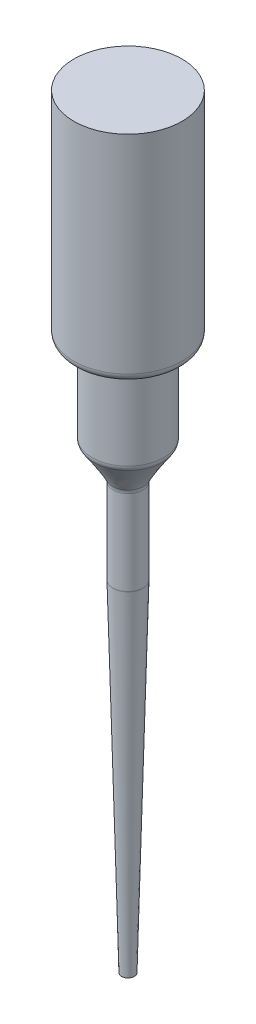
ISO-10303-21;
HEADER;
FILE_DESCRIPTION(('STEP AP214'),'2;1');
FILE_NAME('part.step','',(''),(''),'','','');
FILE_SCHEMA(('AUTOMOTIVE_DESIGN { 1 0 10303 214 1 1 1 1 }'));
ENDSEC;
DATA;
#1=APPLICATION_CONTEXT('core data for automotive mechanical design processes');
#2=APPLICATION_PROTOCOL_DEFINITION('international standard','automotive_design',2000,#1);
#3=PRODUCT_CONTEXT('',#1,'mechanical');
#4=PRODUCT('Part','Part','',(#3));
#5=PRODUCT_RELATED_PRODUCT_CATEGORY('part','',(#4));
#6=PRODUCT_DEFINITION_FORMATION('','',#4);
#7=PRODUCT_DEFINITION_CONTEXT('part definition',#1,'design');
#8=PRODUCT_DEFINITION('design','',#6,#7);
#9=PRODUCT_DEFINITION_SHAPE('','',#8);
#10=(LENGTH_UNIT() NAMED_UNIT(*) SI_UNIT(.MILLI.,.METRE.));
#11=(NAMED_UNIT(*) PLANE_ANGLE_UNIT() SI_UNIT($,.RADIAN.));
#12=(NAMED_UNIT(*) SI_UNIT($,.STERADIAN.) SOLID_ANGLE_UNIT());
#13=UNCERTAINTY_MEASURE_WITH_UNIT(LENGTH_MEASURE(1.E-05),#10,'distance_accuracy_value','');
#14=(GEOMETRIC_REPRESENTATION_CONTEXT(3) GLOBAL_UNCERTAINTY_ASSIGNED_CONTEXT((#13)) GLOBAL_UNIT_ASSIGNED_CONTEXT((#10,
#11,#12)) REPRESENTATION_CONTEXT('',''));
#15=CARTESIAN_POINT('',(0.,0.,0.));
#16=DIRECTION('',(0.,0.,1.));
#17=DIRECTION('',(1.,0.,0.));
#18=AXIS2_PLACEMENT_3D('',#15,#16,#17);
#19=CARTESIAN_POINT('',(0.,127.,0.));
#20=DIRECTION('',(0.,-1.,0.));
#21=DIRECTION('',(0.,0.,-1.));
#22=AXIS2_PLACEMENT_3D('',#19,#20,#21);
#23=CYLINDRICAL_SURFACE('',#22,31.75);
#24=CARTESIAN_POINT('',(0.,5.,0.));
#25=DIRECTION('',(0.,1.,0.));
#26=DIRECTION('',(0.,0.,1.));
#27=AXIS2_PLACEMENT_3D('',#24,#25,#26);
#28=CIRCLE('',#27,31.75);
#29=CARTESIAN_POINT('',(0.,5.,31.75));
#30=VERTEX_POINT('',#29);
#31=EDGE_CURVE('E53',#30,#30,#28,.T.);
#32=ORIENTED_EDGE('',*,*,#31,.T.);
#33=EDGE_LOOP('',(#32));
#34=FACE_BOUND('',#33,.T.);
#35=CARTESIAN_POINT('',(0.,127.,0.));
#36=DIRECTION('',(0.,1.,0.));
#37=DIRECTION('',(0.,0.,1.));
#38=AXIS2_PLACEMENT_3D('',#35,#36,#37);
#39=CIRCLE('',#38,31.75);
#40=CARTESIAN_POINT('',(0.,127.,31.75));
#41=VERTEX_POINT('',#40);
#42=EDGE_CURVE('E86',#41,#41,#39,.T.);
#43=ORIENTED_EDGE('',*,*,#42,.F.);
#44=EDGE_LOOP('',(#43));
#45=FACE_BOUND('',#44,.T.);
#46=ADVANCED_FACE('F45',(#34,#45),#23,.T.);
#47=CARTESIAN_POINT('',(0.,127.,0.));
#48=DIRECTION('',(0.,1.,0.));
#49=DIRECTION('',(0.,0.,1.));
#50=AXIS2_PLACEMENT_3D('',#47,#48,#49);
#51=PLANE('',#50);
#52=ORIENTED_EDGE('',*,*,#42,.T.);
#53=EDGE_LOOP('',(#52));
#54=FACE_BOUND('',#53,.T.);
#55=ADVANCED_FACE('F139',(#54),#51,.T.);
#56=CARTESIAN_POINT('',(0.,0.,0.));
#57=DIRECTION('',(0.,1.,0.));
#58=DIRECTION('',(0.,0.,1.));
#59=AXIS2_PLACEMENT_3D('',#56,#57,#58);
#60=PLANE('',#59);
#61=CARTESIAN_POINT('',(0.,0.,0.));
#62=DIRECTION('',(0.,1.,0.));
#63=DIRECTION('',(0.,0.,1.));
#64=AXIS2_PLACEMENT_3D('',#61,#62,#63);
#65=CIRCLE('',#64,26.75);
#66=CARTESIAN_POINT('',(0.,0.,26.75));
#67=VERTEX_POINT('',#66);
#68=EDGE_CURVE('E11',#67,#67,#65,.F.);
#69=ORIENTED_EDGE('',*,*,#68,.T.);
#70=EDGE_LOOP('',(#69));
#71=FACE_BOUND('',#70,.T.);
#72=CARTESIAN_POINT('',(0.,0.,0.));
#73=DIRECTION('',(0.,-1.,0.));
#74=DIRECTION('',(0.,0.,-1.));
#75=AXIS2_PLACEMENT_3D('',#72,#73,#74);
#76=CIRCLE('',#75,21.0178498664078);
#77=CARTESIAN_POINT('',(0.,0.,21.0178498664078));
#78=VERTEX_POINT('',#77);
#79=EDGE_CURVE('E85',#78,#78,#76,.T.);
#80=ORIENTED_EDGE('',*,*,#79,.F.);
#81=EDGE_LOOP('',(#80));
#82=FACE_BOUND('',#81,.T.);
#83=ADVANCED_FACE('F137',(#71,#82),#60,.F.);
#84=CARTESIAN_POINT('',(0.,-51.,0.));
#85=DIRECTION('',(0.,1.,0.));
#86=DIRECTION('',(0.,0.,1.));
#87=AXIS2_PLACEMENT_3D('',#84,#85,#86);
#88=CYLINDRICAL_SURFACE('',#87,21.0178498664078);
#89=CARTESIAN_POINT('',(0.,-49.4517571965937,0.));
#90=DIRECTION('',(0.,1.,0.));
#91=DIRECTION('',(0.,0.,1.));
#92=AXIS2_PLACEMENT_3D('',#89,#90,#91);
#93=CIRCLE('',#92,21.0178498664078);
#94=CARTESIAN_POINT('',(0.,-49.4517571965937,21.0178498664078));
#95=VERTEX_POINT('',#94);
#96=EDGE_CURVE('E58',#95,#95,#93,.T.);
#97=CARTESIAN_POINT('',(0.,-49.4517571965937,21.0178498664078));
#98=CARTESIAN_POINT('',(0.,-48.9366347257958,21.0178498664078));
#99=CARTESIAN_POINT('',(0.,-48.421512254998,21.0178498664078));
#100=CARTESIAN_POINT('',(0.,-47.3912673134023,21.0178498664078));
#101=CARTESIAN_POINT('',(0.,-46.8761448426044,21.0178498664078));
#102=CARTESIAN_POINT('',(0.,-45.8458999010087,21.0178498664078));
#103=CARTESIAN_POINT('',(0.,-45.3307774302109,21.0178498664078));
#104=CARTESIAN_POINT('',(0.,-44.3005324886152,21.0178498664078));
#105=CARTESIAN_POINT('',(0.,-43.7854100178173,21.0178498664078));
#106=CARTESIAN_POINT('',(0.,-42.7551650762216,21.0178498664078));
#107=CARTESIAN_POINT('',(0.,-42.2400426054238,21.0178498664078));
#108=CARTESIAN_POINT('',(0.,-41.2097976638281,21.0178498664078));
#109=CARTESIAN_POINT('',(0.,-40.6946751930302,21.0178498664078));
#110=CARTESIAN_POINT('',(0.,-39.6644302514345,21.0178498664078));
#111=CARTESIAN_POINT('',(0.,-39.1493077806367,21.0178498664078));
#112=CARTESIAN_POINT('',(0.,-38.119062839041,21.0178498664078));
#113=CARTESIAN_POINT('',(0.,-37.6039403682431,21.0178498664078));
#114=CARTESIAN_POINT('',(0.,-36.5736954266474,21.0178498664078));
#115=CARTESIAN_POINT('',(0.,-36.0585729558496,21.0178498664078));
#116=CARTESIAN_POINT('',(0.,-35.0283280142539,21.0178498664078));
#117=CARTESIAN_POINT('',(0.,-34.513205543456,21.0178498664078));
#118=CARTESIAN_POINT('',(0.,-33.4829606018603,21.0178498664078));
#119=CARTESIAN_POINT('',(0.,-32.9678381310625,21.0178498664078));
#120=CARTESIAN_POINT('',(0.,-31.9375931894667,21.0178498664078));
#121=CARTESIAN_POINT('',(0.,-31.4224707186689,21.0178498664078));
#122=CARTESIAN_POINT('',(0.,-30.3922257770732,21.0178498664078));
#123=CARTESIAN_POINT('',(0.,-29.8771033062753,21.0178498664078));
#124=CARTESIAN_POINT('',(0.,-28.8468583646796,21.0178498664078));
#125=CARTESIAN_POINT('',(0.,-28.3317358938818,21.0178498664078));
#126=CARTESIAN_POINT('',(0.,-27.3014909522861,21.0178498664078));
#127=CARTESIAN_POINT('',(0.,-26.7863684814882,21.0178498664078));
#128=CARTESIAN_POINT('',(0.,-25.7561235398925,21.0178498664078));
#129=CARTESIAN_POINT('',(0.,-25.2410010690947,21.0178498664078));
#130=CARTESIAN_POINT('',(0.,-24.210756127499,21.0178498664078));
#131=CARTESIAN_POINT('',(0.,-23.6956336567011,21.0178498664078));
#132=CARTESIAN_POINT('',(0.,-22.6653887151054,21.0178498664078));
#133=CARTESIAN_POINT('',(0.,-22.1502662443076,21.0178498664078));
#134=CARTESIAN_POINT('',(0.,-21.1200213027119,21.0178498664078));
#135=CARTESIAN_POINT('',(0.,-20.604898831914,21.0178498664078));
#136=CARTESIAN_POINT('',(0.,-19.5746538903183,21.0178498664078));
#137=CARTESIAN_POINT('',(0.,-19.0595314195205,21.0178498664078));
#138=CARTESIAN_POINT('',(0.,-18.0292864779248,21.0178498664078));
#139=CARTESIAN_POINT('',(0.,-17.5141640071269,21.0178498664078));
#140=CARTESIAN_POINT('',(0.,-16.4839190655312,21.0178498664078));
#141=CARTESIAN_POINT('',(0.,-15.9687965947334,21.0178498664078));
#142=CARTESIAN_POINT('',(0.,-14.9385516531377,21.0178498664078));
#143=CARTESIAN_POINT('',(0.,-14.4234291823398,21.0178498664078));
#144=CARTESIAN_POINT('',(0.,-13.3931842407441,21.0178498664078));
#145=CARTESIAN_POINT('',(0.,-12.8780617699463,21.0178498664078));
#146=CARTESIAN_POINT('',(0.,-11.8478168283506,21.0178498664078));
#147=CARTESIAN_POINT('',(0.,-11.3326943575527,21.0178498664078));
#148=CARTESIAN_POINT('',(0.,-10.302449415957,21.0178498664078));
#149=CARTESIAN_POINT('',(0.,-9.78732694515916,21.0178498664078));
#150=CARTESIAN_POINT('',(0.,-8.75708200356346,21.0178498664078));
#151=CARTESIAN_POINT('',(0.,-8.24195953276561,21.0178498664078));
#152=CARTESIAN_POINT('',(0.,-7.21171459116991,21.0178498664078));
#153=CARTESIAN_POINT('',(0.,-6.69659212037206,21.0178498664078));
#154=CARTESIAN_POINT('',(0.,-5.66634717877636,21.0178498664078));
#155=CARTESIAN_POINT('',(0.,-5.15122470797851,21.0178498664078));
#156=CARTESIAN_POINT('',(0.,-4.1209797663828,21.0178498664078));
#157=CARTESIAN_POINT('',(0.,-3.60585729558495,21.0178498664078));
#158=CARTESIAN_POINT('',(0.,-2.57561235398925,21.0178498664078));
#159=CARTESIAN_POINT('',(0.,-2.0604898831914,21.0178498664078));
#160=CARTESIAN_POINT('',(0.,-1.0302449415957,21.0178498664078));
#161=CARTESIAN_POINT('',(0.,-0.515122470797852,21.0178498664078));
#162=CARTESIAN_POINT('',(0.,0.,21.0178498664078));
#163=B_SPLINE_CURVE_WITH_KNOTS('',3,(#97,#98,#99,#100,#101,#102,#103,#104,#105,#106,#107,#108,
#109,#110,#111,#112,#113,#114,#115,#116,#117,#118,#119,#120,#121,#122,#123,#124,#125,#126,#127,
#128,#129,#130,#131,#132,#133,#134,#135,#136,#137,#138,#139,#140,#141,#142,#143,#144,#145,#146,
#147,#148,#149,#150,#151,#152,#153,#154,#155,#156,#157,#158,#159,#160,#161,#162),.UNSPECIFIED.,
.F.,.F.,(4,2,2,2,2,2,2,2,2,2,2,2,2,2,2,2,2,2,2,2,2,2,2,2,2,2,2,2,2,2,2,2,4),(0.,
1.54536741239356,3.0907348247871,4.63610223718066,6.18146964957422,7.72683706196776,
9.27220447436132,10.8175718867549,12.3629392991484,13.908306711542,15.4536741239355,
16.9990415363291,18.5444089487226,20.0897763611162,21.6351437735097,23.1805111859033,
24.7258785982968,26.2712460106904,27.8166134230839,29.3619808354775,30.9073482478711,
32.4527156602646,33.9980830726581,35.5434504850517,37.0888178974453,38.6341853098388,
40.1795527222324,41.7249201346259,43.2702875470195,44.815654959413,46.3610223718066,
47.9063897842001,49.4517571965937),.UNSPECIFIED.);
#164=EDGE_CURVE('BSEAM128',#95,#78,#163,.T.);
#165=ORIENTED_EDGE('',*,*,#96,.T.);
#166=ORIENTED_EDGE('',*,*,#79,.T.);
#167=ORIENTED_EDGE('',*,*,#164,.T.);
#168=ORIENTED_EDGE('',*,*,#164,.F.);
#169=EDGE_LOOP('',(#165,#167,#166,#168));
#170=FACE_BOUND('',#169,.T.);
#171=ADVANCED_FACE('F128',(#170),#88,.T.);
#172=CARTESIAN_POINT('',(-20.3443344832862,-51.,5.27807421689297));
#173=CARTESIAN_POINT('',(-8.25953812337909,-71.,-2.84042604778188));
#174=CARTESIAN_POINT('',(-30.9004829170722,-51.,-35.4105947496795));
#175=CARTESIAN_POINT('',(-2.57868602781534,-71.,-19.3595022945401));
#176=CARTESIAN_POINT('',(9.78818604950028,-51.,-45.9667431834654));
#177=CARTESIAN_POINT('',(13.9403902189428,-71.,-13.6786501989763));
#178=CARTESIAN_POINT('',(20.3443344832862,-51.,-5.27807421689298));
#179=CARTESIAN_POINT('',(8.25953812337909,-71.,2.84042604778187));
#180=CARTESIAN_POINT('',(30.9004829170722,-51.,35.4105947496795));
#181=CARTESIAN_POINT('',(2.57868602781535,-70.9999999999999,19.3595022945401));
#182=CARTESIAN_POINT('',(-9.78818604950027,-51.,45.9667431834654));
#183=CARTESIAN_POINT('',(-13.9403902189428,-70.9999999999999,13.6786501989763));
#184=CARTESIAN_POINT('',(-20.3443344832862,-51.,5.27807421689297));
#185=CARTESIAN_POINT('',(-8.25953812337909,-71.,-2.84042604778188));
#186=(BOUNDED_SURFACE() B_SPLINE_SURFACE(3,1,((#172,#173),(#174,#175),(#176,#177),(#178,#179),
(#180,#181),(#182,#183),(#184,#185)),.UNSPECIFIED.,.T.,.F.,.F.) B_SPLINE_SURFACE_WITH_KNOTS((4,
3,4),(2,2),(0.,0.5,1.),(0.,1.),
.UNSPECIFIED.) GEOMETRIC_REPRESENTATION_ITEM() RATIONAL_B_SPLINE_SURFACE(((1.,1.),
(0.333333333333334,0.333333333333334),(0.333333333333334,0.333333333333334),(1.,1.),
(0.333333333333333,0.333333333333333),(0.333333333333333,0.333333333333333),(1.,1.))) REPRESENTATION_ITEM('') SURFACE());
#187=CARTESIAN_POINT('',(0.,-69.9375041125855,0.));
#188=DIRECTION('',(0.,-1.,0.));
#189=DIRECTION('',(0.,0.,-1.));
#190=AXIS2_PLACEMENT_3D('',#187,#188,#189);
#191=CIRCLE('',#190,9.22178622446412);
#192=CARTESIAN_POINT('',(-8.90154044501122,-69.9375041125855,-2.40913239062237));
#193=VERTEX_POINT('',#192);
#194=EDGE_CURVE('E63',#193,#193,#191,.F.);
#195=CARTESIAN_POINT('',(0.,-52.2719468430174,0.));
#196=DIRECTION('',(0.,-1.,0.));
#197=DIRECTION('',(0.,0.,-1.));
#198=AXIS2_PLACEMENT_3D('',#195,#196,#197);
#199=CIRCLE('',#198,20.1465942709701);
#200=CARTESIAN_POINT('',(-19.5757735543616,-52.2719468430174,4.76175917780848));
#201=VERTEX_POINT('',#200);
#202=EDGE_CURVE('E69',#201,#201,#199,.T.);
#203=CARTESIAN_POINT('',(-8.90154044501122,-69.9375041125855,-2.40913239062237));
#204=CARTESIAN_POINT('',(-9.01273037323363,-69.7534878910275,-2.33443560345121));
#205=CARTESIAN_POINT('',(-9.12392030145603,-69.5694716694695,-2.25973881628006));
#206=CARTESIAN_POINT('',(-9.34630015790082,-69.2014392263535,-2.11034524193775));
#207=CARTESIAN_POINT('',(-9.45749008612322,-69.0174230047955,-2.03564845476659));
#208=CARTESIAN_POINT('',(-9.67986994256802,-68.6493905616795,-1.88625488042429));
#209=CARTESIAN_POINT('',(-9.79105987079042,-68.4653743401215,-1.81155809325313));
#210=CARTESIAN_POINT('',(-10.0134397272352,-68.0973418970055,-1.66216451891082));
#211=CARTESIAN_POINT('',(-10.1246296554576,-67.9133256754475,-1.58746773173967));
#212=CARTESIAN_POINT('',(-10.3470095119024,-67.5452932323315,-1.43807415739736));
#213=CARTESIAN_POINT('',(-10.4581994401248,-67.3612770107735,-1.3633773702262));
#214=CARTESIAN_POINT('',(-10.6805792965696,-66.9932445676575,-1.21398379588389));
#215=CARTESIAN_POINT('',(-10.791769224792,-66.8092283460995,-1.13928700871274));
#216=CARTESIAN_POINT('',(-11.0141490812368,-66.4411959029835,-0.989893434370431));
#217=CARTESIAN_POINT('',(-11.1253390094592,-66.2571796814255,-0.915196647199276));
#218=CARTESIAN_POINT('',(-11.347718865904,-65.8891472383095,-0.765803072856966));
#219=CARTESIAN_POINT('',(-11.4589087941264,-65.7051310167515,-0.691106285685811));
#220=CARTESIAN_POINT('',(-11.6812886505712,-65.3370985736355,-0.541712711343502));
#221=CARTESIAN_POINT('',(-11.7924785787936,-65.1530823520775,-0.467015924172348));
#222=CARTESIAN_POINT('',(-12.0148584352384,-64.7850499089615,-0.317622349830039));
#223=CARTESIAN_POINT('',(-12.1260483634608,-64.6010336874035,-0.242925562658884));
#224=CARTESIAN_POINT('',(-12.3484282199056,-64.2330012442875,-0.0935319883165748));
#225=CARTESIAN_POINT('',(-12.459618148128,-64.0489850227295,-0.0188352011454201));
#226=CARTESIAN_POINT('',(-12.6819980045728,-63.6809525796135,0.130558373196889));
#227=CARTESIAN_POINT('',(-12.7931879327952,-63.4969363580555,0.205255160368044));
#228=CARTESIAN_POINT('',(-13.01556778924,-63.1289039149395,0.354648734710353));
#229=CARTESIAN_POINT('',(-13.1267577174624,-62.9448876933815,0.429345521881507));
#230=CARTESIAN_POINT('',(-13.3491375739072,-62.5768552502655,0.578739096223816));
#231=CARTESIAN_POINT('',(-13.4603275021296,-62.3928390287075,0.653435883394971));
#232=CARTESIAN_POINT('',(-13.6827073585744,-62.0248065855915,0.802829457737281));
#233=CARTESIAN_POINT('',(-13.7938972867968,-61.8407903640335,0.877526244908435));
#234=CARTESIAN_POINT('',(-14.0162771432416,-61.4727579209175,1.02691981925074));
#235=CARTESIAN_POINT('',(-14.127467071464,-61.2887416993595,1.1016166064219));
#236=CARTESIAN_POINT('',(-14.3498469279088,-60.9207092562435,1.25101018076421));
#237=CARTESIAN_POINT('',(-14.4610368561312,-60.7366930346855,1.32570696793536));
#238=CARTESIAN_POINT('',(-14.683416712576,-60.3686605915695,1.47510054227767));
#239=CARTESIAN_POINT('',(-14.7946066407984,-60.1846443700115,1.54979732944883));
#240=CARTESIAN_POINT('',(-15.0169864972432,-59.8166119268955,1.69919090379114));
#241=CARTESIAN_POINT('',(-15.1281764254656,-59.6325957053375,1.77388769096229));
#242=CARTESIAN_POINT('',(-15.3505562819104,-59.2645632622215,1.9232812653046));
#243=CARTESIAN_POINT('',(-15.4617462101328,-59.0805470406635,1.99797805247575));
#244=CARTESIAN_POINT('',(-15.6841260665776,-58.7125145975475,2.14737162681806));
#245=CARTESIAN_POINT('',(-15.7953159948,-58.5284983759895,2.22206841398922));
#246=CARTESIAN_POINT('',(-16.0176958512448,-58.1604659328735,2.37146198833153));
#247=CARTESIAN_POINT('',(-16.1288857794672,-57.9764497113155,2.44615877550268));
#248=CARTESIAN_POINT('',(-16.351265635912,-57.6084172681995,2.59555234984499));
#249=CARTESIAN_POINT('',(-16.4624555641344,-57.4244010466415,2.67024913701615));
#250=CARTESIAN_POINT('',(-16.6848354205792,-57.0563686035255,2.81964271135846));
#251=CARTESIAN_POINT('',(-16.7960253488016,-56.8723523819675,2.89433949852961));
#252=CARTESIAN_POINT('',(-17.0184052052464,-56.5043199388515,3.04373307287192));
#253=CARTESIAN_POINT('',(-17.1295951334688,-56.3203037172935,3.11842986004307));
#254=CARTESIAN_POINT('',(-17.3519749899136,-55.9522712741774,3.26782343438538));
#255=CARTESIAN_POINT('',(-17.463164918136,-55.7682550526195,3.34252022155654));
#256=CARTESIAN_POINT('',(-17.6855447745808,-55.4002226095035,3.49191379589885));
#257=CARTESIAN_POINT('',(-17.7967347028032,-55.2162063879454,3.56661058307));
#258=CARTESIAN_POINT('',(-18.019114559248,-54.8481739448294,3.71600415741231));
#259=CARTESIAN_POINT('',(-18.1303044874704,-54.6641577232715,3.79070094458346));
#260=CARTESIAN_POINT('',(-18.3526843439152,-54.2961252801555,3.94009451892577));
#261=CARTESIAN_POINT('',(-18.4638742721376,-54.1121090585974,4.01479130609693));
#262=CARTESIAN_POINT('',(-18.6862541285824,-53.7440766154814,4.16418488043924));
#263=CARTESIAN_POINT('',(-18.7974440568048,-53.5600603939235,4.23888166761039));
#264=CARTESIAN_POINT('',(-19.0198239132496,-53.1920279508074,4.3882752419527));
#265=CARTESIAN_POINT('',(-19.131013841472,-53.0080117292494,4.46297202912386));
#266=CARTESIAN_POINT('',(-19.3533936979168,-52.6399792861334,4.61236560346617));
#267=CARTESIAN_POINT('',(-19.4645836261392,-52.4559630645754,4.68706239063732));
#268=CARTESIAN_POINT('',(-19.5757735543616,-52.2719468430174,4.76175917780848));
#269=B_SPLINE_CURVE_WITH_KNOTS('',3,(#203,#204,#205,#206,#207,#208,#209,#210,#211,#212,#213,
#214,#215,#216,#217,#218,#219,#220,#221,#222,#223,#224,#225,#226,#227,#228,#229,#230,#231,#232,
#233,#234,#235,#236,#237,#238,#239,#240,#241,#242,#243,#244,#245,#246,#247,#248,#249,#250,#251,
#252,#253,#254,#255,#256,#257,#258,#259,#260,#261,#262,#263,#264,#265,#266,#267,#268),
.UNSPECIFIED.,.F.,.F.,(4,2,2,2,2,2,2,2,2,2,2,2,2,2,2,2,2,2,2,2,2,2,2,2,2,2,2,2,2,2,2,2,4),(0.,
0.682819902708234,1.36563980541649,2.04845970812475,2.73127961083299,3.41409951354124,
4.0969194162495,4.77973931895774,5.46255922166599,6.14537912437424,6.82819902708249,
7.51101892979074,8.19383883249899,8.87665873520725,9.5594786379155,10.2422985406237,
10.925118443332,11.6079383460402,12.2907582487485,12.9735781514567,13.656398054165,
14.3392179568732,15.0220378595815,15.7048577622897,16.387677664998,17.0704975677062,
17.7533174704145,18.4361373731227,19.118957275831,19.8017771785392,20.4845970812475,
21.1674169839557,21.850236886664),.UNSPECIFIED.);
#270=EDGE_CURVE('BSEAM122',#193,#201,#269,.T.);
#271=ORIENTED_EDGE('',*,*,#194,.T.);
#272=ORIENTED_EDGE('',*,*,#202,.T.);
#273=ORIENTED_EDGE('',*,*,#270,.T.);
#274=ORIENTED_EDGE('',*,*,#270,.F.);
#275=EDGE_LOOP('',(#271,#273,#272,#274));
#276=FACE_BOUND('',#275,.T.);
#277=ADVANCED_FACE('F122',(#276),#186,.T.);
#278=CARTESIAN_POINT('',(0.,-122.,0.));
#279=DIRECTION('',(0.,1.,0.));
#280=DIRECTION('',(0.,0.,1.));
#281=AXIS2_PLACEMENT_3D('',#278,#279,#280);
#282=CYLINDRICAL_SURFACE('',#281,8.73429963674652);
#283=CARTESIAN_POINT('',(0.,-121.935495604257,0.));
#284=DIRECTION('',(0.,1.,0.));
#285=DIRECTION('',(0.,0.,1.));
#286=AXIS2_PLACEMENT_3D('',#283,#284,#285);
#287=CIRCLE('',#286,8.73429963674652);
#288=CARTESIAN_POINT('',(0.,-121.935495604257,8.73429963674652));
#289=VERTEX_POINT('',#288);
#290=EDGE_CURVE('E73',#289,#289,#287,.T.);
#291=CARTESIAN_POINT('',(0.,-72.0909252752872,0.));
#292=DIRECTION('',(0.,-1.,0.));
#293=DIRECTION('',(0.,0.,-1.));
#294=AXIS2_PLACEMENT_3D('',#291,#292,#293);
#295=CIRCLE('',#294,8.73429963674652);
#296=CARTESIAN_POINT('',(0.,-72.0909252752872,8.73429963674652));
#297=VERTEX_POINT('',#296);
#298=EDGE_CURVE('E77',#297,#297,#295,.T.);
#299=CARTESIAN_POINT('',(0.,-121.935495604257,8.73429963674652));
#300=CARTESIAN_POINT('',(0.,-121.416281329997,8.73429963674652));
#301=CARTESIAN_POINT('',(0.,-120.897067055737,8.73429963674652));
#302=CARTESIAN_POINT('',(0.,-119.858638507216,8.73429963674652));
#303=CARTESIAN_POINT('',(0.,-119.339424232956,8.73429963674652));
#304=CARTESIAN_POINT('',(0.,-118.300995684436,8.73429963674652));
#305=CARTESIAN_POINT('',(0.,-117.781781410176,8.73429963674652));
#306=CARTESIAN_POINT('',(0.,-116.743352861656,8.73429963674652));
#307=CARTESIAN_POINT('',(0.,-116.224138587396,8.73429963674652));
#308=CARTESIAN_POINT('',(0.,-115.185710038875,8.73429963674652));
#309=CARTESIAN_POINT('',(0.,-114.666495764615,8.73429963674652));
#310=CARTESIAN_POINT('',(0.,-113.628067216095,8.73429963674652));
#311=CARTESIAN_POINT('',(0.,-113.108852941835,8.73429963674652));
#312=CARTESIAN_POINT('',(0.,-112.070424393315,8.73429963674652));
#313=CARTESIAN_POINT('',(0.,-111.551210119055,8.73429963674652));
#314=CARTESIAN_POINT('',(0.,-110.512781570535,8.73429963674652));
#315=CARTESIAN_POINT('',(0.,-109.993567296274,8.73429963674652));
#316=CARTESIAN_POINT('',(0.,-108.955138747754,8.73429963674652));
#317=CARTESIAN_POINT('',(0.,-108.435924473494,8.73429963674652));
#318=CARTESIAN_POINT('',(0.,-107.397495924974,8.73429963674652));
#319=CARTESIAN_POINT('',(0.,-106.878281650714,8.73429963674652));
#320=CARTESIAN_POINT('',(0.,-105.839853102194,8.73429963674652));
#321=CARTESIAN_POINT('',(0.,-105.320638827934,8.73429963674652));
#322=CARTESIAN_POINT('',(0.,-104.282210279413,8.73429963674652));
#323=CARTESIAN_POINT('',(0.,-103.762996005153,8.73429963674652));
#324=CARTESIAN_POINT('',(0.,-102.724567456633,8.73429963674652));
#325=CARTESIAN_POINT('',(0.,-102.205353182373,8.73429963674652));
#326=CARTESIAN_POINT('',(0.,-101.166924633853,8.73429963674652));
#327=CARTESIAN_POINT('',(0.,-100.647710359593,8.73429963674652));
#328=CARTESIAN_POINT('',(0.,-99.6092818110724,8.73429963674652));
#329=CARTESIAN_POINT('',(0.,-99.0900675368124,8.73429963674652));
#330=CARTESIAN_POINT('',(0.,-98.0516389882922,8.73429963674652));
#331=CARTESIAN_POINT('',(0.,-97.5324247140321,8.73429963674652));
#332=CARTESIAN_POINT('',(0.,-96.4939961655119,8.73429963674652));
#333=CARTESIAN_POINT('',(0.,-95.9747818912518,8.73429963674652));
#334=CARTESIAN_POINT('',(0.,-94.9363533427316,8.73429963674652));
#335=CARTESIAN_POINT('',(0.,-94.4171390684715,8.73429963674652));
#336=CARTESIAN_POINT('',(0.,-93.3787105199513,8.73429963674652));
#337=CARTESIAN_POINT('',(0.,-92.8594962456912,8.73429963674652));
#338=CARTESIAN_POINT('',(0.,-91.821067697171,8.73429963674652));
#339=CARTESIAN_POINT('',(0.,-91.3018534229109,8.73429963674652));
#340=CARTESIAN_POINT('',(0.,-90.2634248743907,8.73429963674652));
#341=CARTESIAN_POINT('',(0.,-89.7442106001306,8.73429963674652));
#342=CARTESIAN_POINT('',(0.,-88.7057820516104,8.73429963674652));
#343=CARTESIAN_POINT('',(0.,-88.1865677773503,8.73429963674652));
#344=CARTESIAN_POINT('',(0.,-87.1481392288301,8.73429963674652));
#345=CARTESIAN_POINT('',(0.,-86.62892495457,8.73429963674652));
#346=CARTESIAN_POINT('',(0.,-85.5904964060498,8.73429963674652));
#347=CARTESIAN_POINT('',(0.,-85.0712821317897,8.73429963674652));
#348=CARTESIAN_POINT('',(0.,-84.0328535832695,8.73429963674652));
#349=CARTESIAN_POINT('',(0.,-83.5136393090094,8.73429963674652));
#350=CARTESIAN_POINT('',(0.,-82.4752107604892,8.73429963674652));
#351=CARTESIAN_POINT('',(0.,-81.9559964862291,8.73429963674652));
#352=CARTESIAN_POINT('',(0.,-80.9175679377089,8.73429963674652));
#353=CARTESIAN_POINT('',(0.,-80.3983536634488,8.73429963674652));
#354=CARTESIAN_POINT('',(0.,-79.3599251149286,8.73429963674652));
#355=CARTESIAN_POINT('',(0.,-78.8407108406685,8.73429963674652));
#356=CARTESIAN_POINT('',(0.,-77.8022822921483,8.73429963674652));
#357=CARTESIAN_POINT('',(0.,-77.2830680178882,8.73429963674652));
#358=CARTESIAN_POINT('',(0.,-76.244639469368,8.73429963674652));
#359=CARTESIAN_POINT('',(0.,-75.7254251951079,8.73429963674652));
#360=CARTESIAN_POINT('',(0.,-74.6869966465877,8.73429963674652));
#361=CARTESIAN_POINT('',(0.,-74.1677823723276,8.73429963674652));
#362=CARTESIAN_POINT('',(0.,-73.1293538238074,8.73429963674652));
#363=CARTESIAN_POINT('',(0.,-72.6101395495473,8.73429963674652));
#364=CARTESIAN_POINT('',(0.,-72.0909252752872,8.73429963674652));
#365=B_SPLINE_CURVE_WITH_KNOTS('',3,(#299,#300,#301,#302,#303,#304,#305,#306,#307,#308,#309,
#310,#311,#312,#313,#314,#315,#316,#317,#318,#319,#320,#321,#322,#323,#324,#325,#326,#327,#328,
#329,#330,#331,#332,#333,#334,#335,#336,#337,#338,#339,#340,#341,#342,#343,#344,#345,#346,#347,
#348,#349,#350,#351,#352,#353,#354,#355,#356,#357,#358,#359,#360,#361,#362,#363,#364),
.UNSPECIFIED.,.F.,.F.,(4,2,2,2,2,2,2,2,2,2,2,2,2,2,2,2,2,2,2,2,2,2,2,2,2,2,2,2,2,2,2,2,4),(0.,
1.5576428227803,3.1152856455606,4.6729284683409,6.2305712911212,7.78821411390149,
9.34585693668179,10.9034997594621,12.4611425822424,14.0187854050227,15.576428227803,
17.1340710505833,18.6917138733636,20.2493566961439,21.8069995189242,23.3646423417045,
24.9222851644848,26.4799279872651,28.0375708100454,29.5952136328256,31.1528564556059,
32.7104992783863,34.2681421011665,35.8257849239468,37.3834277467271,38.9410705695074,
40.4987133922877,42.056356215068,43.6139990378483,45.1716418606286,46.7292846834089,
48.2869275061892,49.8445703289695),.UNSPECIFIED.);
#366=EDGE_CURVE('BSEAM115',#289,#297,#365,.T.);
#367=ORIENTED_EDGE('',*,*,#290,.T.);
#368=ORIENTED_EDGE('',*,*,#298,.T.);
#369=ORIENTED_EDGE('',*,*,#366,.T.);
#370=ORIENTED_EDGE('',*,*,#366,.F.);
#371=EDGE_LOOP('',(#367,#369,#368,#370));
#372=FACE_BOUND('',#371,.T.);
#373=ADVANCED_FACE('F115',(#372),#282,.T.);
#374=CARTESIAN_POINT('',(0.,-322.,0.));
#375=DIRECTION('',(0.,-1.,0.));
#376=DIRECTION('',(0.,0.,-1.));
#377=AXIS2_PLACEMENT_3D('',#374,#375,#376);
#378=PLANE('',#377);
#379=CARTESIAN_POINT('',(0.,-322.,0.));
#380=DIRECTION('',(0.,-1.,0.));
#381=DIRECTION('',(0.,0.,-1.));
#382=AXIS2_PLACEMENT_3D('',#379,#380,#381);
#383=CIRCLE('',#382,3.75656520317524);
#384=CARTESIAN_POINT('',(1.22907256360417,-322.,-3.54981165121511));
#385=VERTEX_POINT('',#384);
#386=EDGE_CURVE('E90',#385,#385,#383,.T.);
#387=ORIENTED_EDGE('',*,*,#386,.T.);
#388=EDGE_LOOP('',(#387));
#389=FACE_BOUND('',#388,.T.);
#390=ADVANCED_FACE('F104',(#389),#378,.T.);
#391=CARTESIAN_POINT('',(5.26616727695819,-122.,-6.96817568346014));
#392=CARTESIAN_POINT('',(1.22907256360417,-322.,-3.54981165121511));
#393=CARTESIAN_POINT('',(19.2025186438785,-122.,3.56415887045625));
#394=CARTESIAN_POINT('',(8.32869586603438,-322.,-1.09166652400677));
#395=CARTESIAN_POINT('',(8.67018408996208,-122.,17.5005102373765));
#396=CARTESIAN_POINT('',(5.87055073882604,-322.,6.00795677842345));
#397=CARTESIAN_POINT('',(-5.26616727695819,-122.,6.96817568346014));
#398=CARTESIAN_POINT('',(-1.22907256360417,-322.,3.54981165121511));
#399=CARTESIAN_POINT('',(-19.2025186438785,-122.,-3.56415887045625));
#400=CARTESIAN_POINT('',(-8.32869586603438,-322.,1.09166652400677));
#401=CARTESIAN_POINT('',(-8.67018408996208,-122.,-17.5005102373765));
#402=CARTESIAN_POINT('',(-5.87055073882604,-322.,-6.00795677842345));
#403=CARTESIAN_POINT('',(5.26616727695819,-122.,-6.96817568346014));
#404=CARTESIAN_POINT('',(1.22907256360417,-322.,-3.54981165121511));
#405=(BOUNDED_SURFACE() B_SPLINE_SURFACE(3,1,((#391,#392),(#393,#394),(#395,#396),(#397,#398),
(#399,#400),(#401,#402),(#403,#404)),.UNSPECIFIED.,.T.,.F.,.F.) B_SPLINE_SURFACE_WITH_KNOTS((4,
3,4),(2,2),(0.,0.5,1.),(0.,1.),
.UNSPECIFIED.) GEOMETRIC_REPRESENTATION_ITEM() RATIONAL_B_SPLINE_SURFACE(((1.,1.),
(0.333333333333333,0.333333333333333),(0.333333333333333,0.333333333333333),(1.,1.),
(0.333333333333333,0.333333333333333),(0.333333333333333,0.333333333333333),(1.,1.))) REPRESENTATION_ITEM('') SURFACE());
#406=CARTESIAN_POINT('',(0.,-122.064482307821,0.));
#407=DIRECTION('',(0.,-1.,0.));
#408=DIRECTION('',(0.,0.,-1.));
#409=AXIS2_PLACEMENT_3D('',#406,#407,#408);
#410=CIRCLE('',#409,8.73263560287601);
#411=CARTESIAN_POINT('',(5.26486567103815,-122.064482307821,-6.96707356345128));
#412=VERTEX_POINT('',#411);
#413=EDGE_CURVE('E81',#412,#412,#410,.T.);
#414=CARTESIAN_POINT('',(5.26486567103815,-122.064482307821,-6.96707356345128));
#415=CARTESIAN_POINT('',(5.22282615950237,-124.147143950448,-6.93147708519882));
#416=CARTESIAN_POINT('',(5.1807866479666,-126.229805593075,-6.89588060694636));
#417=CARTESIAN_POINT('',(5.09670762489506,-130.395128878329,-6.82468765044144));
#418=CARTESIAN_POINT('',(5.05466811335929,-132.477790520955,-6.78909117218898));
#419=CARTESIAN_POINT('',(4.97058909028775,-136.643113806209,-6.71789821568406));
#420=CARTESIAN_POINT('',(4.92854957875198,-138.725775448836,-6.6823017374316));
#421=CARTESIAN_POINT('',(4.84447055568044,-142.89109873409,-6.61110878092668));
#422=CARTESIAN_POINT('',(4.80243104414467,-144.973760376717,-6.57551230267422));
#423=CARTESIAN_POINT('',(4.71835202107313,-149.13908366197,-6.5043193461693));
#424=CARTESIAN_POINT('',(4.67631250953736,-151.221745304597,-6.46872286791684));
#425=CARTESIAN_POINT('',(4.59223348646582,-155.387068589851,-6.39752991141192));
#426=CARTESIAN_POINT('',(4.55019397493004,-157.469730232478,-6.36193343315946));
#427=CARTESIAN_POINT('',(4.4661149518585,-161.635053517731,-6.29074047665454));
#428=CARTESIAN_POINT('',(4.42407544032273,-163.717715160358,-6.25514399840208));
#429=CARTESIAN_POINT('',(4.33999641725119,-167.883038445612,-6.18395104189716));
#430=CARTESIAN_POINT('',(4.29795690571542,-169.965700088239,-6.14835456364469));
#431=CARTESIAN_POINT('',(4.21387788264388,-174.131023373493,-6.07716160713978));
#432=CARTESIAN_POINT('',(4.17183837110811,-176.21368501612,-6.04156512888732));
#433=CARTESIAN_POINT('',(4.08775934803657,-180.379008301373,-5.9703721723824));
#434=CARTESIAN_POINT('',(4.0457198365008,-182.461669944,-5.93477569412993));
#435=CARTESIAN_POINT('',(3.96164081342926,-186.626993229254,-5.86358273762501));
#436=CARTESIAN_POINT('',(3.91960130189349,-188.709654871881,-5.82798625937255));
#437=CARTESIAN_POINT('',(3.83552227882195,-192.874978157134,-5.75679330286763));
#438=CARTESIAN_POINT('',(3.79348276728618,-194.957639799761,-5.72119682461517));
#439=CARTESIAN_POINT('',(3.70940374421463,-199.122963085015,-5.65000386811025));
#440=CARTESIAN_POINT('',(3.66736423267886,-201.205624727642,-5.61440738985779));
#441=CARTESIAN_POINT('',(3.58328520960732,-205.370948012896,-5.54321443335287));
#442=CARTESIAN_POINT('',(3.54124569807155,-207.453609655522,-5.50761795510041));
#443=CARTESIAN_POINT('',(3.45716667500001,-211.618932940776,-5.43642499859549));
#444=CARTESIAN_POINT('',(3.41512716346424,-213.701594583403,-5.40082852034303));
#445=CARTESIAN_POINT('',(3.3310481403927,-217.866917868657,-5.32963556383811));
#446=CARTESIAN_POINT('',(3.28900862885693,-219.949579511284,-5.29403908558565));
#447=CARTESIAN_POINT('',(3.20492960578539,-224.114902796537,-5.22284612908073));
#448=CARTESIAN_POINT('',(3.16289009424962,-226.197564439164,-5.18724965082827));
#449=CARTESIAN_POINT('',(3.07881107117808,-230.362887724418,-5.11605669432335));
#450=CARTESIAN_POINT('',(3.0367715596423,-232.445549367045,-5.08046021607089));
#451=CARTESIAN_POINT('',(2.95269253657076,-236.610872652299,-5.00926725956597));
#452=CARTESIAN_POINT('',(2.91065302503499,-238.693534294925,-4.97367078131351));
#453=CARTESIAN_POINT('',(2.82657400196345,-242.858857580179,-4.90247782480859));
#454=CARTESIAN_POINT('',(2.78453449042768,-244.941519222806,-4.86688134655613));
#455=CARTESIAN_POINT('',(2.70045546735614,-249.10684250806,-4.79568839005121));
#456=CARTESIAN_POINT('',(2.65841595582037,-251.189504150687,-4.76009191179875));
#457=CARTESIAN_POINT('',(2.57433693274883,-255.35482743594,-4.68889895529383));
#458=CARTESIAN_POINT('',(2.53229742121306,-257.437489078567,-4.65330247704137));
#459=CARTESIAN_POINT('',(2.44821839814152,-261.602812363821,-4.58210952053645));
#460=CARTESIAN_POINT('',(2.40617888660575,-263.685474006448,-4.54651304228399));
#461=CARTESIAN_POINT('',(2.3220998635342,-267.850797291702,-4.47532008577907));
#462=CARTESIAN_POINT('',(2.28006035199843,-269.933458934328,-4.43972360752661));
#463=CARTESIAN_POINT('',(2.19598132892689,-274.098782219582,-4.36853065102169));
#464=CARTESIAN_POINT('',(2.15394181739112,-276.181443862209,-4.33293417276923));
#465=CARTESIAN_POINT('',(2.06986279431958,-280.346767147463,-4.26174121626431));
#466=CARTESIAN_POINT('',(2.02782328278381,-282.42942879009,-4.22614473801185));
#467=CARTESIAN_POINT('',(1.94374425971227,-286.594752075343,-4.15495178150693));
#468=CARTESIAN_POINT('',(1.9017047481765,-288.67741371797,-4.11935530325447));
#469=CARTESIAN_POINT('',(1.81762572510496,-292.842737003224,-4.04816234674955));
#470=CARTESIAN_POINT('',(1.77558621356919,-294.925398645851,-4.01256586849709));
#471=CARTESIAN_POINT('',(1.69150719049765,-299.090721931104,-3.94137291199217));
#472=CARTESIAN_POINT('',(1.64946767896188,-301.173383573731,-3.90577643373971));
#473=CARTESIAN_POINT('',(1.56538865589033,-305.338706858985,-3.83458347723479));
#474=CARTESIAN_POINT('',(1.52334914435456,-307.421368501612,-3.79898699898233));
#475=CARTESIAN_POINT('',(1.43927012128302,-311.586691786866,-3.72779404247741));
#476=CARTESIAN_POINT('',(1.39723060974725,-313.669353429493,-3.69219756422495));
#477=CARTESIAN_POINT('',(1.31315158667571,-317.834676714746,-3.62100460772003));
#478=CARTESIAN_POINT('',(1.27111207513994,-319.917338357373,-3.58540812946757));
#479=CARTESIAN_POINT('',(1.22907256360417,-322.,-3.54981165121511));
#480=B_SPLINE_CURVE_WITH_KNOTS('',3,(#414,#415,#416,#417,#418,#419,#420,#421,#422,#423,#424,
#425,#426,#427,#428,#429,#430,#431,#432,#433,#434,#435,#436,#437,#438,#439,#440,#441,#442,#443,
#444,#445,#446,#447,#448,#449,#450,#451,#452,#453,#454,#455,#456,#457,#458,#459,#460,#461,#462,
#463,#464,#465,#466,#467,#468,#469,#470,#471,#472,#473,#474,#475,#476,#477,#478,#479),
.UNSPECIFIED.,.F.,.F.,(4,2,2,2,2,2,2,2,2,2,2,2,2,2,2,2,2,2,2,2,2,2,2,2,2,2,2,2,2,2,2,2,4),(0.,
6.25017003986054,12.5003400797211,18.7505101195816,25.0006801594422,31.2508501993027,
37.5010202391632,43.7511902790238,50.0013603188843,56.2515303587449,62.5017003986054,
68.751870438466,75.0020404783265,81.252210518187,87.5023805580476,93.7525505979081,
100.002720637769,106.252890677629,112.50306071749,118.75323075735,125.003400797211,
131.253570837071,137.503740876932,143.753910916792,150.004080956653,156.254250996513,
162.504421036374,168.754591076235,175.004761116095,181.254931155956,187.505101195816,
193.755271235677,200.005441275537),.UNSPECIFIED.);
#481=EDGE_CURVE('BSEAM114',#412,#385,#480,.T.);
#482=ORIENTED_EDGE('',*,*,#413,.T.);
#483=ORIENTED_EDGE('',*,*,#386,.F.);
#484=ORIENTED_EDGE('',*,*,#481,.T.);
#485=ORIENTED_EDGE('',*,*,#481,.F.);
#486=EDGE_LOOP('',(#482,#484,#483,#485));
#487=FACE_BOUND('',#486,.T.);
#488=ADVANCED_FACE('F114',(#487),#405,.T.);
#489=CARTESIAN_POINT('',(0.,-121.935495604257,0.));
#490=DIRECTION('',(0.,1.,0.));
#491=DIRECTION('',(0.,0.,1.));
#492=AXIS2_PLACEMENT_3D('',#489,#490,#491);
#493=DEGENERATE_TOROIDAL_SURFACE('',#492,3.73429963674652,5.,.T.);
#494=ORIENTED_EDGE('',*,*,#290,.F.);
#495=EDGE_LOOP('',(#494));
#496=FACE_BOUND('',#495,.T.);
#497=ORIENTED_EDGE('',*,*,#413,.F.);
#498=EDGE_LOOP('',(#497));
#499=FACE_BOUND('',#498,.T.);
#500=ADVANCED_FACE('F147',(#496,#499),#493,.T.);
#501=CARTESIAN_POINT('',(0.,-72.0909252752872,0.));
#502=DIRECTION('',(0.,-1.,0.));
#503=DIRECTION('',(0.,0.,-1.));
#504=AXIS2_PLACEMENT_3D('',#501,#502,#503);
#505=TOROIDAL_SURFACE('',#504,13.7342996367465,5.);
#506=ORIENTED_EDGE('',*,*,#194,.F.);
#507=EDGE_LOOP('',(#506));
#508=FACE_BOUND('',#507,.T.);
#509=ORIENTED_EDGE('',*,*,#298,.F.);
#510=EDGE_LOOP('',(#509));
#511=FACE_BOUND('',#510,.T.);
#512=ADVANCED_FACE('F150',(#508,#511),#505,.F.);
#513=CARTESIAN_POINT('',(0.,-49.4517571965937,0.));
#514=DIRECTION('',(0.,1.,0.));
#515=DIRECTION('',(0.,0.,1.));
#516=AXIS2_PLACEMENT_3D('',#513,#514,#515);
#517=TOROIDAL_SURFACE('',#516,16.0178498664078,5.);
#518=ORIENTED_EDGE('',*,*,#96,.F.);
#519=EDGE_LOOP('',(#518));
#520=FACE_BOUND('',#519,.T.);
#521=ORIENTED_EDGE('',*,*,#202,.F.);
#522=EDGE_LOOP('',(#521));
#523=FACE_BOUND('',#522,.T.);
#524=ADVANCED_FACE('F153',(#520,#523),#517,.T.);
#525=CARTESIAN_POINT('',(0.,5.,0.));
#526=DIRECTION('',(0.,1.,0.));
#527=DIRECTION('',(0.,0.,1.));
#528=AXIS2_PLACEMENT_3D('',#525,#526,#527);
#529=TOROIDAL_SURFACE('',#528,26.75,5.);
#530=ORIENTED_EDGE('',*,*,#68,.F.);
#531=EDGE_LOOP('',(#530));
#532=FACE_BOUND('',#531,.T.);
#533=ORIENTED_EDGE('',*,*,#31,.F.);
#534=EDGE_LOOP('',(#533));
#535=FACE_BOUND('',#534,.T.);
#536=ADVANCED_FACE('F47',(#532,#535),#529,.T.);
#537=CLOSED_SHELL('',(#46,#55,#83,#171,#277,#373,#390,#488,#500,#512,#524,#536));
#538=MANIFOLD_SOLID_BREP('B2',#537);
#539=ADVANCED_BREP_SHAPE_REPRESENTATION('',(#18,#538),#14);
#540=SHAPE_DEFINITION_REPRESENTATION(#9,#539);
ENDSEC;
END-ISO-10303-21;
